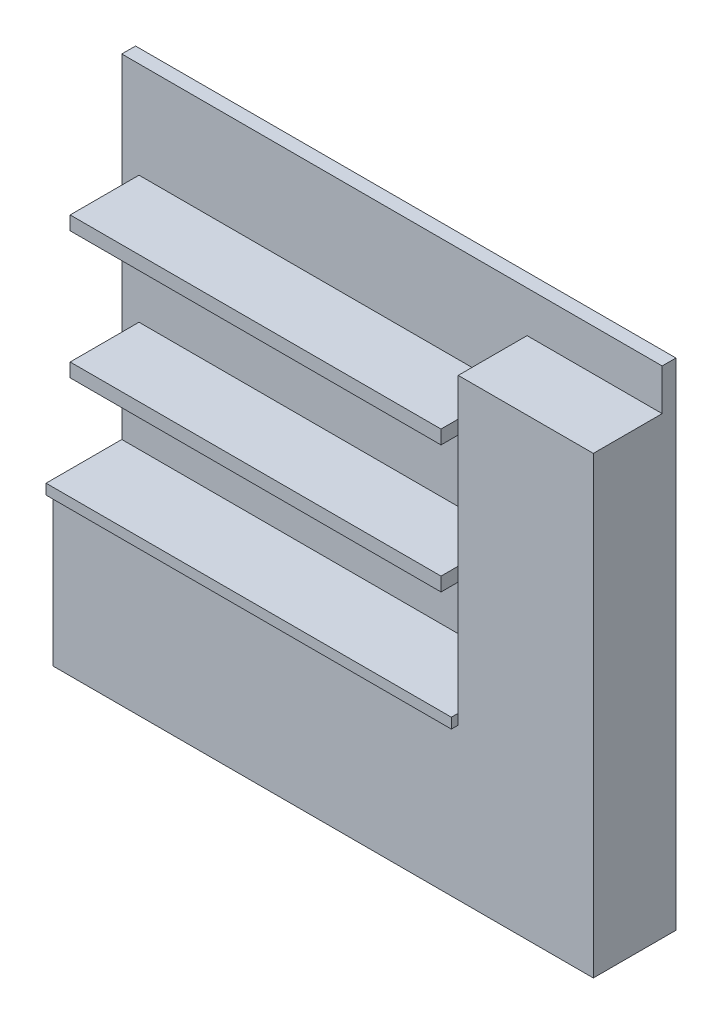
ISO-10303-21;
HEADER;
FILE_DESCRIPTION(('STEP AP214'),'2;1');
FILE_NAME('part.step','',(''),(''),'','','');
FILE_SCHEMA(('AUTOMOTIVE_DESIGN { 1 0 10303 214 1 1 1 1 }'));
ENDSEC;
DATA;
#1=APPLICATION_CONTEXT('core data for automotive mechanical design processes');
#2=APPLICATION_PROTOCOL_DEFINITION('international standard','automotive_design',2000,#1);
#3=PRODUCT_CONTEXT('',#1,'mechanical');
#4=PRODUCT('Part','Part','',(#3));
#5=PRODUCT_RELATED_PRODUCT_CATEGORY('part','',(#4));
#6=PRODUCT_DEFINITION_FORMATION('','',#4);
#7=PRODUCT_DEFINITION_CONTEXT('part definition',#1,'design');
#8=PRODUCT_DEFINITION('design','',#6,#7);
#9=PRODUCT_DEFINITION_SHAPE('','',#8);
#10=(LENGTH_UNIT() NAMED_UNIT(*) SI_UNIT(.MILLI.,.METRE.));
#11=(NAMED_UNIT(*) PLANE_ANGLE_UNIT() SI_UNIT($,.RADIAN.));
#12=(NAMED_UNIT(*) SI_UNIT($,.STERADIAN.) SOLID_ANGLE_UNIT());
#13=UNCERTAINTY_MEASURE_WITH_UNIT(LENGTH_MEASURE(1.E-05),#10,'distance_accuracy_value','');
#14=(GEOMETRIC_REPRESENTATION_CONTEXT(3) GLOBAL_UNCERTAINTY_ASSIGNED_CONTEXT((#13)) GLOBAL_UNIT_ASSIGNED_CONTEXT((#10,
#11,#12)) REPRESENTATION_CONTEXT('',''));
#15=CARTESIAN_POINT('',(0.,0.,0.));
#16=DIRECTION('',(0.,0.,1.));
#17=DIRECTION('',(1.,0.,0.));
#18=AXIS2_PLACEMENT_3D('',#15,#16,#17);
#19=CARTESIAN_POINT('',(0.,0.,101.6));
#20=DIRECTION('',(0.,0.,1.));
#21=DIRECTION('',(1.,0.,0.));
#22=AXIS2_PLACEMENT_3D('',#19,#20,#21);
#23=PLANE('',#22);
#24=DIRECTION('',(0.,-1.,0.));
#25=VECTOR('',#24,1.);
#26=CARTESIAN_POINT('',(-1993.9,1828.8,101.6));
#27=LINE('',#26,#25);
#28=CARTESIAN_POINT('',(-1993.9,1828.8,101.6));
#29=VERTEX_POINT('',#28);
#30=CARTESIAN_POINT('',(-1993.9,-635.,101.6));
#31=VERTEX_POINT('',#30);
#32=EDGE_CURVE('E316',#29,#31,#27,.T.);
#33=ORIENTED_EDGE('',*,*,#32,.T.);
#34=DIRECTION('',(-1.,0.,0.));
#35=VECTOR('',#34,1.);
#36=CARTESIAN_POINT('',(-1993.9,-635.,101.6));
#37=LINE('',#36,#35);
#38=CARTESIAN_POINT('',(996.950000000001,-635.,101.6));
#39=VERTEX_POINT('',#38);
#40=EDGE_CURVE('E246',#39,#31,#37,.T.);
#41=ORIENTED_EDGE('',*,*,#40,.F.);
#42=DIRECTION('',(0.,-1.,0.));
#43=VECTOR('',#42,1.);
#44=CARTESIAN_POINT('',(996.950000000001,-711.200000000001,101.6));
#45=LINE('',#44,#43);
#46=CARTESIAN_POINT('',(996.950000000001,1524.,101.6));
#47=VERTEX_POINT('',#46);
#48=EDGE_CURVE('E282',#47,#39,#45,.T.);
#49=ORIENTED_EDGE('',*,*,#48,.F.);
#50=DIRECTION('',(-1.,0.,0.));
#51=VECTOR('',#50,1.);
#52=CARTESIAN_POINT('',(996.950000000001,1524.,101.6));
#53=LINE('',#52,#51);
#54=CARTESIAN_POINT('',(1993.9,1524.,101.6));
#55=VERTEX_POINT('',#54);
#56=EDGE_CURVE('E276',#55,#47,#53,.T.);
#57=ORIENTED_EDGE('',*,*,#56,.F.);
#58=DIRECTION('',(0.,1.,0.));
#59=VECTOR('',#58,1.);
#60=CARTESIAN_POINT('',(1993.9,1828.8,101.6));
#61=LINE('',#60,#59);
#62=CARTESIAN_POINT('',(1993.9,1828.8,101.6));
#63=VERTEX_POINT('',#62);
#64=EDGE_CURVE('E320',#55,#63,#61,.T.);
#65=ORIENTED_EDGE('',*,*,#64,.T.);
#66=DIRECTION('',(-1.,0.,0.));
#67=VECTOR('',#66,1.);
#68=CARTESIAN_POINT('',(-1993.9,1828.8,101.6));
#69=LINE('',#68,#67);
#70=EDGE_CURVE('E324',#63,#29,#69,.T.);
#71=ORIENTED_EDGE('',*,*,#70,.T.);
#72=EDGE_LOOP('',(#33,#41,#49,#57,#65,#71));
#73=FACE_BOUND('',#72,.T.);
#74=DIRECTION('',(0.,-1.,0.));
#75=VECTOR('',#74,1.);
#76=CARTESIAN_POINT('',(-1866.9,76.1999999999997,101.6));
#77=LINE('',#76,#75);
#78=CARTESIAN_POINT('',(-1866.9,177.8,101.6));
#79=VERTEX_POINT('',#78);
#80=CARTESIAN_POINT('',(-1866.9,76.1999999999997,101.6));
#81=VERTEX_POINT('',#80);
#82=EDGE_CURVE('E206',#79,#81,#77,.T.);
#83=ORIENTED_EDGE('',*,*,#82,.F.);
#84=DIRECTION('',(-1.,0.,0.));
#85=VECTOR('',#84,1.);
#86=CARTESIAN_POINT('',(-1866.9,177.8,101.6));
#87=LINE('',#86,#85);
#88=CARTESIAN_POINT('',(869.950000000001,177.8,101.6));
#89=VERTEX_POINT('',#88);
#90=EDGE_CURVE('E200',#89,#79,#87,.T.);
#91=ORIENTED_EDGE('',*,*,#90,.F.);
#92=DIRECTION('',(0.,1.,0.));
#93=VECTOR('',#92,1.);
#94=CARTESIAN_POINT('',(869.950000000001,177.8,101.6));
#95=LINE('',#94,#93);
#96=CARTESIAN_POINT('',(869.950000000001,76.2000000000006,101.6));
#97=VERTEX_POINT('',#96);
#98=EDGE_CURVE('E217',#97,#89,#95,.T.);
#99=ORIENTED_EDGE('',*,*,#98,.F.);
#100=DIRECTION('',(1.,0.,0.));
#101=VECTOR('',#100,1.);
#102=CARTESIAN_POINT('',(869.950000000001,76.2000000000006,101.6));
#103=LINE('',#102,#101);
#104=EDGE_CURVE('E229',#81,#97,#103,.T.);
#105=ORIENTED_EDGE('',*,*,#104,.F.);
#106=EDGE_LOOP('',(#83,#91,#99,#105));
#107=FACE_BOUND('',#106,.T.);
#108=DIRECTION('',(-1.,0.,0.));
#109=VECTOR('',#108,1.);
#110=CARTESIAN_POINT('',(869.950000000001,1117.6,101.6));
#111=LINE('',#110,#109);
#112=CARTESIAN_POINT('',(869.950000000001,1117.6,101.6));
#113=VERTEX_POINT('',#112);
#114=CARTESIAN_POINT('',(-1866.9,1117.6,101.6));
#115=VERTEX_POINT('',#114);
#116=EDGE_CURVE('E404',#113,#115,#111,.T.);
#117=ORIENTED_EDGE('',*,*,#116,.F.);
#118=DIRECTION('',(0.,1.,0.));
#119=VECTOR('',#118,1.);
#120=CARTESIAN_POINT('',(869.950000000001,1016.,101.6));
#121=LINE('',#120,#119);
#122=CARTESIAN_POINT('',(869.950000000001,1016.,101.6));
#123=VERTEX_POINT('',#122);
#124=EDGE_CURVE('E197',#123,#113,#121,.T.);
#125=ORIENTED_EDGE('',*,*,#124,.F.);
#126=DIRECTION('',(1.,0.,0.));
#127=VECTOR('',#126,1.);
#128=CARTESIAN_POINT('',(-1866.9,1016.,101.6));
#129=LINE('',#128,#127);
#130=CARTESIAN_POINT('',(-1866.9,1016.,101.6));
#131=VERTEX_POINT('',#130);
#132=EDGE_CURVE('E193',#131,#123,#129,.T.);
#133=ORIENTED_EDGE('',*,*,#132,.F.);
#134=DIRECTION('',(0.,-1.,0.));
#135=VECTOR('',#134,1.);
#136=CARTESIAN_POINT('',(-1866.9,1117.6,101.6));
#137=LINE('',#136,#135);
#138=EDGE_CURVE('E407',#115,#131,#137,.T.);
#139=ORIENTED_EDGE('',*,*,#138,.F.);
#140=EDGE_LOOP('',(#117,#125,#133,#139));
#141=FACE_BOUND('',#140,.T.);
#142=ADVANCED_FACE('F42',(#73,#107,#141),#23,.T.);
#143=CARTESIAN_POINT('',(996.950000000001,-711.200000000001,609.6));
#144=DIRECTION('',(1.,0.,0.));
#145=DIRECTION('',(0.,0.,-1.));
#146=AXIS2_PLACEMENT_3D('',#143,#144,#145);
#147=PLANE('',#146);
#148=DIRECTION('',(0.,0.,-1.));
#149=VECTOR('',#148,1.);
#150=CARTESIAN_POINT('',(996.950000000001,-635.,660.4));
#151=LINE('',#150,#149);
#152=CARTESIAN_POINT('',(996.950000000001,-635.,609.6));
#153=VERTEX_POINT('',#152);
#154=EDGE_CURVE('E268',#153,#39,#151,.T.);
#155=ORIENTED_EDGE('',*,*,#154,.F.);
#156=DIRECTION('',(0.,-1.,0.));
#157=VECTOR('',#156,1.);
#158=CARTESIAN_POINT('',(996.950000000001,-711.200000000001,609.6));
#159=LINE('',#158,#157);
#160=CARTESIAN_POINT('',(996.950000000001,1524.,609.6));
#161=VERTEX_POINT('',#160);
#162=EDGE_CURVE('E289',#161,#153,#159,.T.);
#163=ORIENTED_EDGE('',*,*,#162,.F.);
#164=DIRECTION('',(0.,0.,-1.));
#165=VECTOR('',#164,1.);
#166=CARTESIAN_POINT('',(996.950000000001,1524.,609.6));
#167=LINE('',#166,#165);
#168=EDGE_CURVE('E301',#161,#47,#167,.T.);
#169=ORIENTED_EDGE('',*,*,#168,.T.);
#170=ORIENTED_EDGE('',*,*,#48,.T.);
#171=EDGE_LOOP('',(#155,#163,#169,#170));
#172=FACE_BOUND('',#171,.T.);
#173=ADVANCED_FACE('F425',(#172),#147,.F.);
#174=CARTESIAN_POINT('',(-1993.9,1828.8,101.6));
#175=DIRECTION('',(1.,0.,0.));
#176=DIRECTION('',(0.,1.,0.));
#177=AXIS2_PLACEMENT_3D('',#174,#175,#176);
#178=PLANE('',#177);
#179=DIRECTION('',(0.,-1.,0.));
#180=VECTOR('',#179,1.);
#181=CARTESIAN_POINT('',(-1993.9,1828.8,0.));
#182=LINE('',#181,#180);
#183=CARTESIAN_POINT('',(-1993.9,1828.8,0.));
#184=VERTEX_POINT('',#183);
#185=CARTESIAN_POINT('',(-1993.9,-1828.8,0.));
#186=VERTEX_POINT('',#185);
#187=EDGE_CURVE('E315',#184,#186,#182,.T.);
#188=ORIENTED_EDGE('',*,*,#187,.T.);
#189=DIRECTION('',(0.,0.,-1.));
#190=VECTOR('',#189,1.);
#191=CARTESIAN_POINT('',(-1993.9,-1828.8,101.6));
#192=LINE('',#191,#190);
#193=CARTESIAN_POINT('',(-1993.9,-1828.8,609.6));
#194=VERTEX_POINT('',#193);
#195=EDGE_CURVE('E11',#194,#186,#192,.T.);
#196=ORIENTED_EDGE('',*,*,#195,.F.);
#197=DIRECTION('',(0.,-1.,0.));
#198=VECTOR('',#197,1.);
#199=CARTESIAN_POINT('',(-1993.9,-1828.8,609.6));
#200=LINE('',#199,#198);
#201=CARTESIAN_POINT('',(-1993.9,-711.200000000001,609.6));
#202=VERTEX_POINT('',#201);
#203=EDGE_CURVE('E297',#202,#194,#200,.T.);
#204=ORIENTED_EDGE('',*,*,#203,.F.);
#205=DIRECTION('',(0.,0.,-1.));
#206=VECTOR('',#205,1.);
#207=CARTESIAN_POINT('',(-1993.9,-711.200000000001,660.4));
#208=LINE('',#207,#206);
#209=CARTESIAN_POINT('',(-1993.9,-711.200000000001,660.4));
#210=VERTEX_POINT('',#209);
#211=EDGE_CURVE('E260',#210,#202,#208,.T.);
#212=ORIENTED_EDGE('',*,*,#211,.F.);
#213=DIRECTION('',(0.,-1.,0.));
#214=VECTOR('',#213,1.);
#215=CARTESIAN_POINT('',(-1993.9,-711.200000000001,660.4));
#216=LINE('',#215,#214);
#217=CARTESIAN_POINT('',(-1993.9,-635.,660.4));
#218=VERTEX_POINT('',#217);
#219=EDGE_CURVE('E257',#218,#210,#216,.T.);
#220=ORIENTED_EDGE('',*,*,#219,.F.);
#221=DIRECTION('',(0.,0.,-1.));
#222=VECTOR('',#221,1.);
#223=CARTESIAN_POINT('',(-1993.9,-635.,660.4));
#224=LINE('',#223,#222);
#225=EDGE_CURVE('E265',#218,#31,#224,.T.);
#226=ORIENTED_EDGE('',*,*,#225,.T.);
#227=ORIENTED_EDGE('',*,*,#32,.F.);
#228=DIRECTION('',(0.,0.,-1.));
#229=VECTOR('',#228,1.);
#230=CARTESIAN_POINT('',(-1993.9,1828.8,101.6));
#231=LINE('',#230,#229);
#232=EDGE_CURVE('E327',#29,#184,#231,.T.);
#233=ORIENTED_EDGE('',*,*,#232,.T.);
#234=EDGE_LOOP('',(#188,#196,#204,#212,#220,#226,#227,#233));
#235=FACE_BOUND('',#234,.T.);
#236=ADVANCED_FACE('F44',(#235),#178,.F.);
#237=CARTESIAN_POINT('',(-1993.9,-1828.8,101.6));
#238=DIRECTION('',(0.,1.,0.));
#239=DIRECTION('',(0.,0.,1.));
#240=AXIS2_PLACEMENT_3D('',#237,#238,#239);
#241=PLANE('',#240);
#242=DIRECTION('',(1.,0.,0.));
#243=VECTOR('',#242,1.);
#244=CARTESIAN_POINT('',(-1993.9,-1828.8,0.));
#245=LINE('',#244,#243);
#246=CARTESIAN_POINT('',(1993.9,-1828.8,0.));
#247=VERTEX_POINT('',#246);
#248=EDGE_CURVE('E331',#186,#247,#245,.T.);
#249=ORIENTED_EDGE('',*,*,#248,.T.);
#250=DIRECTION('',(0.,0.,-1.));
#251=VECTOR('',#250,1.);
#252=CARTESIAN_POINT('',(1993.9,-1828.8,101.6));
#253=LINE('',#252,#251);
#254=CARTESIAN_POINT('',(1993.9,-1828.8,609.6));
#255=VERTEX_POINT('',#254);
#256=EDGE_CURVE('E51',#255,#247,#253,.T.);
#257=ORIENTED_EDGE('',*,*,#256,.F.);
#258=DIRECTION('',(1.,0.,0.));
#259=VECTOR('',#258,1.);
#260=CARTESIAN_POINT('',(1993.9,-1828.8,609.6));
#261=LINE('',#260,#259);
#262=EDGE_CURVE('E277',#194,#255,#261,.T.);
#263=ORIENTED_EDGE('',*,*,#262,.F.);
#264=ORIENTED_EDGE('',*,*,#195,.T.);
#265=EDGE_LOOP('',(#249,#257,#263,#264));
#266=FACE_BOUND('',#265,.T.);
#267=ADVANCED_FACE('F380',(#266),#241,.F.);
#268=CARTESIAN_POINT('',(1993.9,1828.8,101.6));
#269=DIRECTION('',(-1.,0.,0.));
#270=DIRECTION('',(0.,-1.,0.));
#271=AXIS2_PLACEMENT_3D('',#268,#269,#270);
#272=PLANE('',#271);
#273=DIRECTION('',(0.,1.,0.));
#274=VECTOR('',#273,1.);
#275=CARTESIAN_POINT('',(1993.9,1828.8,0.));
#276=LINE('',#275,#274);
#277=CARTESIAN_POINT('',(1993.9,1828.8,0.));
#278=VERTEX_POINT('',#277);
#279=EDGE_CURVE('E334',#247,#278,#276,.T.);
#280=ORIENTED_EDGE('',*,*,#279,.T.);
#281=DIRECTION('',(0.,0.,-1.));
#282=VECTOR('',#281,1.);
#283=CARTESIAN_POINT('',(1993.9,1828.8,101.6));
#284=LINE('',#283,#282);
#285=EDGE_CURVE('E342',#63,#278,#284,.T.);
#286=ORIENTED_EDGE('',*,*,#285,.F.);
#287=ORIENTED_EDGE('',*,*,#64,.F.);
#288=DIRECTION('',(0.,0.,-1.));
#289=VECTOR('',#288,1.);
#290=CARTESIAN_POINT('',(1993.9,1524.,609.6));
#291=LINE('',#290,#289);
#292=CARTESIAN_POINT('',(1993.9,1524.,609.6));
#293=VERTEX_POINT('',#292);
#294=EDGE_CURVE('E311',#293,#55,#291,.T.);
#295=ORIENTED_EDGE('',*,*,#294,.F.);
#296=DIRECTION('',(0.,1.,0.));
#297=VECTOR('',#296,1.);
#298=CARTESIAN_POINT('',(1993.9,1524.,609.6));
#299=LINE('',#298,#297);
#300=EDGE_CURVE('E281',#255,#293,#299,.T.);
#301=ORIENTED_EDGE('',*,*,#300,.F.);
#302=ORIENTED_EDGE('',*,*,#256,.T.);
#303=EDGE_LOOP('',(#280,#286,#287,#295,#301,#302));
#304=FACE_BOUND('',#303,.T.);
#305=ADVANCED_FACE('F350',(#304),#272,.F.);
#306=CARTESIAN_POINT('',(-1993.9,1828.8,101.6));
#307=DIRECTION('',(0.,-1.,0.));
#308=DIRECTION('',(0.,0.,-1.));
#309=AXIS2_PLACEMENT_3D('',#306,#307,#308);
#310=PLANE('',#309);
#311=DIRECTION('',(-1.,0.,0.));
#312=VECTOR('',#311,1.);
#313=CARTESIAN_POINT('',(-1993.9,1828.8,0.));
#314=LINE('',#313,#312);
#315=EDGE_CURVE('E321',#278,#184,#314,.T.);
#316=ORIENTED_EDGE('',*,*,#315,.T.);
#317=ORIENTED_EDGE('',*,*,#232,.F.);
#318=ORIENTED_EDGE('',*,*,#70,.F.);
#319=ORIENTED_EDGE('',*,*,#285,.T.);
#320=EDGE_LOOP('',(#316,#317,#318,#319));
#321=FACE_BOUND('',#320,.T.);
#322=ADVANCED_FACE('F361',(#321),#310,.F.);
#323=CARTESIAN_POINT('',(0.,0.,0.));
#324=DIRECTION('',(0.,0.,1.));
#325=DIRECTION('',(1.,0.,0.));
#326=AXIS2_PLACEMENT_3D('',#323,#324,#325);
#327=PLANE('',#326);
#328=ORIENTED_EDGE('',*,*,#187,.F.);
#329=ORIENTED_EDGE('',*,*,#315,.F.);
#330=ORIENTED_EDGE('',*,*,#279,.F.);
#331=ORIENTED_EDGE('',*,*,#248,.F.);
#332=EDGE_LOOP('',(#328,#329,#330,#331));
#333=FACE_BOUND('',#332,.T.);
#334=ADVANCED_FACE('F358',(#333),#327,.F.);
#335=CARTESIAN_POINT('',(996.950000000001,1524.,609.6));
#336=DIRECTION('',(0.,-1.,0.));
#337=DIRECTION('',(0.,0.,-1.));
#338=AXIS2_PLACEMENT_3D('',#335,#336,#337);
#339=PLANE('',#338);
#340=ORIENTED_EDGE('',*,*,#56,.T.);
#341=ORIENTED_EDGE('',*,*,#168,.F.);
#342=DIRECTION('',(-1.,0.,0.));
#343=VECTOR('',#342,1.);
#344=CARTESIAN_POINT('',(996.950000000001,1524.,609.6));
#345=LINE('',#344,#343);
#346=EDGE_CURVE('E285',#293,#161,#345,.T.);
#347=ORIENTED_EDGE('',*,*,#346,.F.);
#348=ORIENTED_EDGE('',*,*,#294,.T.);
#349=EDGE_LOOP('',(#340,#341,#347,#348));
#350=FACE_BOUND('',#349,.T.);
#351=ADVANCED_FACE('F373',(#350),#339,.F.);
#352=CARTESIAN_POINT('',(0.,0.,609.6));
#353=DIRECTION('',(0.,0.,-1.));
#354=DIRECTION('',(-1.,0.,0.));
#355=AXIS2_PLACEMENT_3D('',#352,#353,#354);
#356=PLANE('',#355);
#357=ORIENTED_EDGE('',*,*,#262,.T.);
#358=ORIENTED_EDGE('',*,*,#300,.T.);
#359=ORIENTED_EDGE('',*,*,#346,.T.);
#360=ORIENTED_EDGE('',*,*,#162,.T.);
#361=CARTESIAN_POINT('',(996.950000000001,-711.200000000001,609.6));
#362=VERTEX_POINT('',#361);
#363=EDGE_CURVE('E288',#153,#362,#159,.T.);
#364=ORIENTED_EDGE('',*,*,#363,.T.);
#365=DIRECTION('',(-1.,0.,0.));
#366=VECTOR('',#365,1.);
#367=CARTESIAN_POINT('',(-1993.9,-711.200000000001,609.6));
#368=LINE('',#367,#366);
#369=EDGE_CURVE('E293',#362,#202,#368,.T.);
#370=ORIENTED_EDGE('',*,*,#369,.T.);
#371=ORIENTED_EDGE('',*,*,#203,.T.);
#372=EDGE_LOOP('',(#357,#358,#359,#360,#364,#370,#371));
#373=FACE_BOUND('',#372,.T.);
#374=ADVANCED_FACE('F377',(#373),#356,.F.);
#375=CARTESIAN_POINT('',(996.950000000001,-711.200000000001,660.4));
#376=DIRECTION('',(0.,1.,0.));
#377=DIRECTION('',(0.,0.,1.));
#378=AXIS2_PLACEMENT_3D('',#375,#376,#377);
#379=PLANE('',#378);
#380=ORIENTED_EDGE('',*,*,#211,.T.);
#381=ORIENTED_EDGE('',*,*,#369,.F.);
#382=DIRECTION('',(0.,0.,-1.));
#383=VECTOR('',#382,1.);
#384=CARTESIAN_POINT('',(996.950000000001,-711.200000000001,660.4));
#385=LINE('',#384,#383);
#386=CARTESIAN_POINT('',(996.950000000001,-711.200000000001,660.4));
#387=VERTEX_POINT('',#386);
#388=EDGE_CURVE('E273',#387,#362,#385,.T.);
#389=ORIENTED_EDGE('',*,*,#388,.F.);
#390=DIRECTION('',(1.,0.,0.));
#391=VECTOR('',#390,1.);
#392=CARTESIAN_POINT('',(996.950000000001,-711.200000000001,660.4));
#393=LINE('',#392,#391);
#394=EDGE_CURVE('E247',#210,#387,#393,.T.);
#395=ORIENTED_EDGE('',*,*,#394,.F.);
#396=EDGE_LOOP('',(#380,#381,#389,#395));
#397=FACE_BOUND('',#396,.T.);
#398=ADVANCED_FACE('F386',(#397),#379,.F.);
#399=CARTESIAN_POINT('',(996.950000000001,-635.,660.4));
#400=DIRECTION('',(-1.,0.,0.));
#401=DIRECTION('',(0.,0.,1.));
#402=AXIS2_PLACEMENT_3D('',#399,#400,#401);
#403=PLANE('',#402);
#404=ORIENTED_EDGE('',*,*,#388,.T.);
#405=ORIENTED_EDGE('',*,*,#363,.F.);
#406=CARTESIAN_POINT('',(996.950000000001,-635.,660.4));
#407=VERTEX_POINT('',#406);
#408=EDGE_CURVE('E269',#407,#153,#151,.T.);
#409=ORIENTED_EDGE('',*,*,#408,.F.);
#410=DIRECTION('',(0.,1.,0.));
#411=VECTOR('',#410,1.);
#412=CARTESIAN_POINT('',(996.950000000001,-635.,660.4));
#413=LINE('',#412,#411);
#414=EDGE_CURVE('E251',#387,#407,#413,.T.);
#415=ORIENTED_EDGE('',*,*,#414,.F.);
#416=EDGE_LOOP('',(#404,#405,#409,#415));
#417=FACE_BOUND('',#416,.T.);
#418=ADVANCED_FACE('F415',(#417),#403,.F.);
#419=CARTESIAN_POINT('',(-1993.9,-635.,660.4));
#420=DIRECTION('',(0.,-1.,0.));
#421=DIRECTION('',(0.,0.,-1.));
#422=AXIS2_PLACEMENT_3D('',#419,#420,#421);
#423=PLANE('',#422);
#424=ORIENTED_EDGE('',*,*,#40,.T.);
#425=ORIENTED_EDGE('',*,*,#225,.F.);
#426=DIRECTION('',(-1.,0.,0.));
#427=VECTOR('',#426,1.);
#428=CARTESIAN_POINT('',(-1993.9,-635.,660.4));
#429=LINE('',#428,#427);
#430=EDGE_CURVE('E254',#407,#218,#429,.T.);
#431=ORIENTED_EDGE('',*,*,#430,.F.);
#432=ORIENTED_EDGE('',*,*,#408,.T.);
#433=ORIENTED_EDGE('',*,*,#154,.T.);
#434=EDGE_LOOP('',(#424,#425,#431,#432,#433));
#435=FACE_BOUND('',#434,.T.);
#436=ADVANCED_FACE('F392',(#435),#423,.F.);
#437=CARTESIAN_POINT('',(0.,0.,660.4));
#438=DIRECTION('',(0.,0.,-1.));
#439=DIRECTION('',(-1.,0.,0.));
#440=AXIS2_PLACEMENT_3D('',#437,#438,#439);
#441=PLANE('',#440);
#442=ORIENTED_EDGE('',*,*,#394,.T.);
#443=ORIENTED_EDGE('',*,*,#414,.T.);
#444=ORIENTED_EDGE('',*,*,#430,.T.);
#445=ORIENTED_EDGE('',*,*,#219,.T.);
#446=EDGE_LOOP('',(#442,#443,#444,#445));
#447=FACE_BOUND('',#446,.T.);
#448=ADVANCED_FACE('F388',(#447),#441,.F.);
#449=CARTESIAN_POINT('',(-1866.9,177.8,609.6));
#450=DIRECTION('',(0.,-1.,0.));
#451=DIRECTION('',(1.,0.,0.));
#452=AXIS2_PLACEMENT_3D('',#449,#450,#451);
#453=PLANE('',#452);
#454=ORIENTED_EDGE('',*,*,#90,.T.);
#455=DIRECTION('',(0.,0.,-1.));
#456=VECTOR('',#455,1.);
#457=CARTESIAN_POINT('',(-1866.9,177.8,609.6));
#458=LINE('',#457,#456);
#459=CARTESIAN_POINT('',(-1866.9,177.8,609.6));
#460=VERTEX_POINT('',#459);
#461=EDGE_CURVE('E243',#460,#79,#458,.T.);
#462=ORIENTED_EDGE('',*,*,#461,.F.);
#463=DIRECTION('',(-1.,0.,0.));
#464=VECTOR('',#463,1.);
#465=CARTESIAN_POINT('',(-1866.9,177.8,609.6));
#466=LINE('',#465,#464);
#467=CARTESIAN_POINT('',(869.950000000001,177.8,609.6));
#468=VERTEX_POINT('',#467);
#469=EDGE_CURVE('E212',#468,#460,#466,.T.);
#470=ORIENTED_EDGE('',*,*,#469,.F.);
#471=DIRECTION('',(0.,0.,-1.));
#472=VECTOR('',#471,1.);
#473=CARTESIAN_POINT('',(869.950000000001,177.8,609.6));
#474=LINE('',#473,#472);
#475=EDGE_CURVE('E225',#468,#89,#474,.T.);
#476=ORIENTED_EDGE('',*,*,#475,.T.);
#477=EDGE_LOOP('',(#454,#462,#470,#476));
#478=FACE_BOUND('',#477,.T.);
#479=ADVANCED_FACE('F493',(#478),#453,.F.);
#480=CARTESIAN_POINT('',(-1866.9,76.1999999999997,609.6));
#481=DIRECTION('',(1.,0.,0.));
#482=DIRECTION('',(0.,0.,-1.));
#483=AXIS2_PLACEMENT_3D('',#480,#481,#482);
#484=PLANE('',#483);
#485=ORIENTED_EDGE('',*,*,#82,.T.);
#486=DIRECTION('',(0.,0.,-1.));
#487=VECTOR('',#486,1.);
#488=CARTESIAN_POINT('',(-1866.9,76.1999999999997,609.6));
#489=LINE('',#488,#487);
#490=CARTESIAN_POINT('',(-1866.9,76.1999999999997,609.6));
#491=VERTEX_POINT('',#490);
#492=EDGE_CURVE('E239',#491,#81,#489,.T.);
#493=ORIENTED_EDGE('',*,*,#492,.F.);
#494=DIRECTION('',(0.,-1.,0.));
#495=VECTOR('',#494,1.);
#496=CARTESIAN_POINT('',(-1866.9,76.1999999999997,609.6));
#497=LINE('',#496,#495);
#498=EDGE_CURVE('E216',#460,#491,#497,.T.);
#499=ORIENTED_EDGE('',*,*,#498,.F.);
#500=ORIENTED_EDGE('',*,*,#461,.T.);
#501=EDGE_LOOP('',(#485,#493,#499,#500));
#502=FACE_BOUND('',#501,.T.);
#503=ADVANCED_FACE('F501',(#502),#484,.F.);
#504=CARTESIAN_POINT('',(869.950000000001,76.2000000000006,609.6));
#505=DIRECTION('',(0.,1.,0.));
#506=DIRECTION('',(-1.,0.,0.));
#507=AXIS2_PLACEMENT_3D('',#504,#505,#506);
#508=PLANE('',#507);
#509=ORIENTED_EDGE('',*,*,#104,.T.);
#510=DIRECTION('',(0.,0.,-1.));
#511=VECTOR('',#510,1.);
#512=CARTESIAN_POINT('',(869.950000000001,76.2000000000006,609.6));
#513=LINE('',#512,#511);
#514=CARTESIAN_POINT('',(869.950000000001,76.2000000000006,609.6));
#515=VERTEX_POINT('',#514);
#516=EDGE_CURVE('E66',#515,#97,#513,.T.);
#517=ORIENTED_EDGE('',*,*,#516,.F.);
#518=DIRECTION('',(1.,0.,0.));
#519=VECTOR('',#518,1.);
#520=CARTESIAN_POINT('',(869.950000000001,76.2000000000006,609.6));
#521=LINE('',#520,#519);
#522=EDGE_CURVE('E220',#491,#515,#521,.T.);
#523=ORIENTED_EDGE('',*,*,#522,.F.);
#524=ORIENTED_EDGE('',*,*,#492,.T.);
#525=EDGE_LOOP('',(#509,#517,#523,#524));
#526=FACE_BOUND('',#525,.T.);
#527=ADVANCED_FACE('F510',(#526),#508,.F.);
#528=CARTESIAN_POINT('',(869.950000000001,177.8,609.6));
#529=DIRECTION('',(-1.,0.,0.));
#530=DIRECTION('',(0.,0.,1.));
#531=AXIS2_PLACEMENT_3D('',#528,#529,#530);
#532=PLANE('',#531);
#533=ORIENTED_EDGE('',*,*,#98,.T.);
#534=ORIENTED_EDGE('',*,*,#475,.F.);
#535=DIRECTION('',(0.,1.,0.));
#536=VECTOR('',#535,1.);
#537=CARTESIAN_POINT('',(869.950000000001,177.8,609.6));
#538=LINE('',#537,#536);
#539=EDGE_CURVE('E223',#515,#468,#538,.T.);
#540=ORIENTED_EDGE('',*,*,#539,.F.);
#541=ORIENTED_EDGE('',*,*,#516,.T.);
#542=EDGE_LOOP('',(#533,#534,#540,#541));
#543=FACE_BOUND('',#542,.T.);
#544=ADVANCED_FACE('F519',(#543),#532,.F.);
#545=CARTESIAN_POINT('',(0.,0.,609.6));
#546=DIRECTION('',(0.,0.,-1.));
#547=DIRECTION('',(-1.,0.,0.));
#548=AXIS2_PLACEMENT_3D('',#545,#546,#547);
#549=PLANE('',#548);
#550=ORIENTED_EDGE('',*,*,#469,.T.);
#551=ORIENTED_EDGE('',*,*,#498,.T.);
#552=ORIENTED_EDGE('',*,*,#522,.T.);
#553=ORIENTED_EDGE('',*,*,#539,.T.);
#554=EDGE_LOOP('',(#550,#551,#552,#553));
#555=FACE_BOUND('',#554,.T.);
#556=ADVANCED_FACE('F528',(#555),#549,.F.);
#557=CARTESIAN_POINT('',(869.950000000001,1016.,609.6));
#558=DIRECTION('',(-1.,0.,0.));
#559=DIRECTION('',(0.,0.,1.));
#560=AXIS2_PLACEMENT_3D('',#557,#558,#559);
#561=PLANE('',#560);
#562=ORIENTED_EDGE('',*,*,#124,.T.);
#563=DIRECTION('',(0.,0.,-1.));
#564=VECTOR('',#563,1.);
#565=CARTESIAN_POINT('',(869.950000000001,1117.6,609.6));
#566=LINE('',#565,#564);
#567=CARTESIAN_POINT('',(869.950000000001,1117.6,609.6));
#568=VERTEX_POINT('',#567);
#569=EDGE_CURVE('E176',#568,#113,#566,.T.);
#570=ORIENTED_EDGE('',*,*,#569,.F.);
#571=DIRECTION('',(0.,1.,0.));
#572=VECTOR('',#571,1.);
#573=CARTESIAN_POINT('',(869.950000000001,1016.,609.6));
#574=LINE('',#573,#572);
#575=CARTESIAN_POINT('',(869.950000000001,1016.,609.6));
#576=VERTEX_POINT('',#575);
#577=EDGE_CURVE('E184',#576,#568,#574,.T.);
#578=ORIENTED_EDGE('',*,*,#577,.F.);
#579=DIRECTION('',(0.,0.,-1.));
#580=VECTOR('',#579,1.);
#581=CARTESIAN_POINT('',(869.950000000001,1016.,609.6));
#582=LINE('',#581,#580);
#583=EDGE_CURVE('E400',#576,#123,#582,.T.);
#584=ORIENTED_EDGE('',*,*,#583,.T.);
#585=EDGE_LOOP('',(#562,#570,#578,#584));
#586=FACE_BOUND('',#585,.T.);
#587=ADVANCED_FACE('F195',(#586),#561,.F.);
#588=CARTESIAN_POINT('',(869.950000000001,1117.6,609.6));
#589=DIRECTION('',(0.,-1.,0.));
#590=DIRECTION('',(1.,0.,0.));
#591=AXIS2_PLACEMENT_3D('',#588,#589,#590);
#592=PLANE('',#591);
#593=ORIENTED_EDGE('',*,*,#116,.T.);
#594=DIRECTION('',(0.,0.,-1.));
#595=VECTOR('',#594,1.);
#596=CARTESIAN_POINT('',(-1866.9,1117.6,609.6));
#597=LINE('',#596,#595);
#598=CARTESIAN_POINT('',(-1866.9,1117.6,609.6));
#599=VERTEX_POINT('',#598);
#600=EDGE_CURVE('E179',#599,#115,#597,.T.);
#601=ORIENTED_EDGE('',*,*,#600,.F.);
#602=DIRECTION('',(-1.,0.,0.));
#603=VECTOR('',#602,1.);
#604=CARTESIAN_POINT('',(869.950000000001,1117.6,609.6));
#605=LINE('',#604,#603);
#606=EDGE_CURVE('E172',#568,#599,#605,.T.);
#607=ORIENTED_EDGE('',*,*,#606,.F.);
#608=ORIENTED_EDGE('',*,*,#569,.T.);
#609=EDGE_LOOP('',(#593,#601,#607,#608));
#610=FACE_BOUND('',#609,.T.);
#611=ADVANCED_FACE('F174',(#610),#592,.F.);
#612=CARTESIAN_POINT('',(-1866.9,1117.6,609.6));
#613=DIRECTION('',(1.,0.,0.));
#614=DIRECTION('',(0.,0.,-1.));
#615=AXIS2_PLACEMENT_3D('',#612,#613,#614);
#616=PLANE('',#615);
#617=ORIENTED_EDGE('',*,*,#138,.T.);
#618=DIRECTION('',(0.,0.,-1.));
#619=VECTOR('',#618,1.);
#620=CARTESIAN_POINT('',(-1866.9,1016.,609.6));
#621=LINE('',#620,#619);
#622=CARTESIAN_POINT('',(-1866.9,1016.,609.6));
#623=VERTEX_POINT('',#622);
#624=EDGE_CURVE('E58',#623,#131,#621,.T.);
#625=ORIENTED_EDGE('',*,*,#624,.F.);
#626=DIRECTION('',(0.,-1.,0.));
#627=VECTOR('',#626,1.);
#628=CARTESIAN_POINT('',(-1866.9,1117.6,609.6));
#629=LINE('',#628,#627);
#630=EDGE_CURVE('E183',#599,#623,#629,.T.);
#631=ORIENTED_EDGE('',*,*,#630,.F.);
#632=ORIENTED_EDGE('',*,*,#600,.T.);
#633=EDGE_LOOP('',(#617,#625,#631,#632));
#634=FACE_BOUND('',#633,.T.);
#635=ADVANCED_FACE('F551',(#634),#616,.F.);
#636=CARTESIAN_POINT('',(-1866.9,1016.,609.6));
#637=DIRECTION('',(0.,1.,0.));
#638=DIRECTION('',(0.,0.,1.));
#639=AXIS2_PLACEMENT_3D('',#636,#637,#638);
#640=PLANE('',#639);
#641=ORIENTED_EDGE('',*,*,#132,.T.);
#642=ORIENTED_EDGE('',*,*,#583,.F.);
#643=DIRECTION('',(1.,0.,0.));
#644=VECTOR('',#643,1.);
#645=CARTESIAN_POINT('',(-1866.9,1016.,609.6));
#646=LINE('',#645,#644);
#647=EDGE_CURVE('E188',#623,#576,#646,.T.);
#648=ORIENTED_EDGE('',*,*,#647,.F.);
#649=ORIENTED_EDGE('',*,*,#624,.T.);
#650=EDGE_LOOP('',(#641,#642,#648,#649));
#651=FACE_BOUND('',#650,.T.);
#652=ADVANCED_FACE('F559',(#651),#640,.F.);
#653=CARTESIAN_POINT('',(0.,0.,609.6));
#654=DIRECTION('',(0.,0.,1.));
#655=DIRECTION('',(1.,0.,0.));
#656=AXIS2_PLACEMENT_3D('',#653,#654,#655);
#657=PLANE('',#656);
#658=ORIENTED_EDGE('',*,*,#577,.T.);
#659=ORIENTED_EDGE('',*,*,#606,.T.);
#660=ORIENTED_EDGE('',*,*,#630,.T.);
#661=ORIENTED_EDGE('',*,*,#647,.T.);
#662=EDGE_LOOP('',(#658,#659,#660,#661));
#663=FACE_BOUND('',#662,.T.);
#664=ADVANCED_FACE('F187',(#663),#657,.T.);
#665=CLOSED_SHELL('',(#142,#173,#236,#267,#305,#322,#334,#351,#374,#398,#418,#436,#448,#479,
#503,#527,#544,#556,#587,#611,#635,#652,#664));
#666=MANIFOLD_SOLID_BREP('B2',#665);
#667=ADVANCED_BREP_SHAPE_REPRESENTATION('',(#18,#666),#14);
#668=SHAPE_DEFINITION_REPRESENTATION(#9,#667);
ENDSEC;
END-ISO-10303-21;
